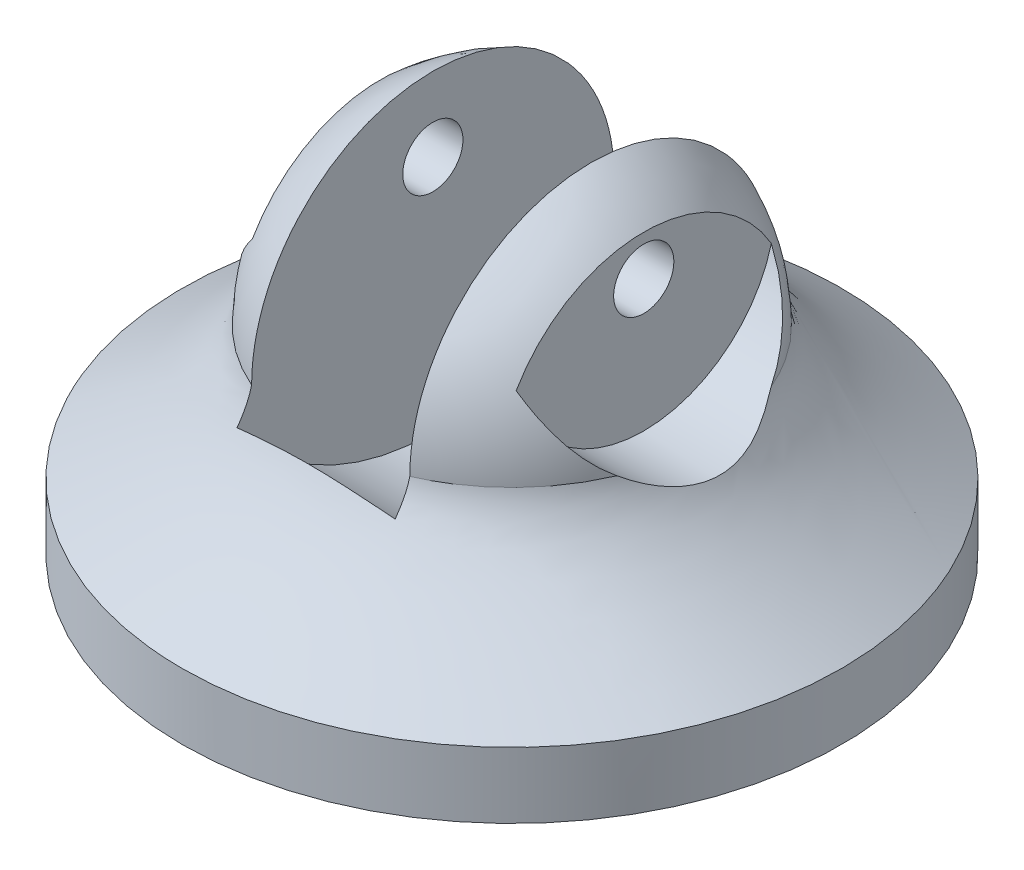
ISO-10303-21;
HEADER;
FILE_DESCRIPTION(('STEP AP214'),'2;1');
FILE_NAME('part.step','',(''),(''),'','','');
FILE_SCHEMA(('AUTOMOTIVE_DESIGN { 1 0 10303 214 1 1 1 1 }'));
ENDSEC;
DATA;
#1=APPLICATION_CONTEXT('core data for automotive mechanical design processes');
#2=APPLICATION_PROTOCOL_DEFINITION('international standard','automotive_design',2000,#1);
#3=PRODUCT_CONTEXT('',#1,'mechanical');
#4=PRODUCT('Part','Part','',(#3));
#5=PRODUCT_RELATED_PRODUCT_CATEGORY('part','',(#4));
#6=PRODUCT_DEFINITION_FORMATION('','',#4);
#7=PRODUCT_DEFINITION_CONTEXT('part definition',#1,'design');
#8=PRODUCT_DEFINITION('design','',#6,#7);
#9=PRODUCT_DEFINITION_SHAPE('','',#8);
#10=(LENGTH_UNIT() NAMED_UNIT(*) SI_UNIT(.MILLI.,.METRE.));
#11=(NAMED_UNIT(*) PLANE_ANGLE_UNIT() SI_UNIT($,.RADIAN.));
#12=(NAMED_UNIT(*) SI_UNIT($,.STERADIAN.) SOLID_ANGLE_UNIT());
#13=UNCERTAINTY_MEASURE_WITH_UNIT(LENGTH_MEASURE(1.E-05),#10,'distance_accuracy_value','');
#14=(GEOMETRIC_REPRESENTATION_CONTEXT(3) GLOBAL_UNCERTAINTY_ASSIGNED_CONTEXT((#13)) GLOBAL_UNIT_ASSIGNED_CONTEXT((#10,
#11,#12)) REPRESENTATION_CONTEXT('',''));
#15=CARTESIAN_POINT('',(0.,0.,0.));
#16=DIRECTION('',(0.,0.,1.));
#17=DIRECTION('',(1.,0.,0.));
#18=AXIS2_PLACEMENT_3D('',#15,#16,#17);
#19=CARTESIAN_POINT('',(0.,6.35,0.));
#20=DIRECTION('',(0.,0.,-1.));
#21=DIRECTION('',(1.,0.,0.));
#22=AXIS2_PLACEMENT_3D('',#19,#20,#21);
#23=SPHERICAL_SURFACE('',#22,9.525);
#24=CARTESIAN_POINT('',(3.03398479089716,6.34999999999998,-9.02887375527008));
#25=CARTESIAN_POINT('',(21.0917323014373,6.34999999999998,-2.96090417347577));
#26=CARTESIAN_POINT('',(15.023762719643,6.34999999999998,15.0968433370644));
#27=CARTESIAN_POINT('',(-3.03398479089716,6.34999999999998,9.02887375527008));
#28=CARTESIAN_POINT('',(-21.0917323014373,6.34999999999998,2.96090417347576));
#29=CARTESIAN_POINT('',(-15.023762719643,6.34999999999998,-15.0968433370644));
#30=CARTESIAN_POINT('',(3.03398479089716,6.34999999999998,-9.02887375527008));
#31=(BOUNDED_CURVE() B_SPLINE_CURVE(3,(#24,#25,#26,#27,#28,#29,#30),.UNSPECIFIED.,.T.,
.F.) B_SPLINE_CURVE_WITH_KNOTS((4,3,4),(0.,0.5,1.),
.UNSPECIFIED.) CURVE() GEOMETRIC_REPRESENTATION_ITEM() RATIONAL_B_SPLINE_CURVE((1.,
0.333333333333333,0.333333333333333,1.,0.333333333333333,0.333333333333333,1.)) REPRESENTATION_ITEM(''));
#32=CARTESIAN_POINT('',(3.81,6.35000000000001,8.72980669889088));
#33=VERTEX_POINT('',#32);
#34=CARTESIAN_POINT('',(8.77072545460181,6.35000000000002,3.71483512420132));
#35=VERTEX_POINT('',#34);
#36=EDGE_CURVE('E123',#33,#35,#31,.F.);
#37=ORIENTED_EDGE('',*,*,#36,.T.);
#38=CARTESIAN_POINT('',(8.77107775589751,6.34939999999999,3.71400318255112));
#39=CARTESIAN_POINT('',(8.7077618303584,6.4572277121186,3.86358955060089));
#40=CARTESIAN_POINT('',(8.64041494247986,6.57076736499505,4.00726830740088));
#41=CARTESIAN_POINT('',(8.4981007902398,6.80757139493222,4.28210049636546));
#42=CARTESIAN_POINT('',(8.42313945804915,6.9308281851716,4.41326352694876));
#43=CARTESIAN_POINT('',(8.2662812289785,7.18498430500689,4.662044324416));
#44=CARTESIAN_POINT('',(8.18441596472406,7.3158480061604,4.77971860394295));
#45=CARTESIAN_POINT('',(8.01381636942561,7.58414079323163,5.00188752946153));
#46=CARTESIAN_POINT('',(7.92508104363113,7.72157082881451,5.10638026105002));
#47=CARTESIAN_POINT('',(7.74135853796951,8.00101028349451,5.3017499536325));
#48=CARTESIAN_POINT('',(7.64639088963747,8.14300474560779,5.39266677814555));
#49=CARTESIAN_POINT('',(7.45024774045632,8.43049050080326,5.56132960000119));
#50=CARTESIAN_POINT('',(7.34907169494656,8.57598210000512,5.63907443951307));
#51=CARTESIAN_POINT('',(7.14081377678903,8.86895571632035,5.78157721160204));
#52=CARTESIAN_POINT('',(7.03373428237884,9.01643691408696,5.84634032589511));
#53=CARTESIAN_POINT('',(6.81385776910183,9.31204339565976,5.9632703278439));
#54=CARTESIAN_POINT('',(6.70106297704109,9.46016840836661,6.01544207640188));
#55=CARTESIAN_POINT('',(6.54680989502385,9.65741768743584,6.07701238976482));
#56=CARTESIAN_POINT('',(6.50781408183392,9.70684723893119,6.09177650982965));
#57=CARTESIAN_POINT('',(6.42924899090146,9.80552650222832,6.11995813711261));
#58=CARTESIAN_POINT('',(6.3896805073571,9.85477636294287,6.13337733655755));
#59=CARTESIAN_POINT('',(6.3498,9.90394805436892,6.14614661286626));
#60=B_SPLINE_CURVE_WITH_KNOTS('',3,(#38,#39,#40,#41,#42,#43,#44,#45,#46,#47,#48,#49,#50,#51,#52,
#53,#54,#55,#56,#57,#58,#59),.UNSPECIFIED.,.F.,.F.,(4,2,2,2,2,2,2,2,2,2,4),(0.,
0.584592865547045,1.16873373651216,1.75033017187832,2.33201097755506,2.91194868247854,
3.49193733809017,4.07169402550626,4.65122653829889,4.84521844810046,5.03896312249994),.UNSPECIFIED.);
#61=CARTESIAN_POINT('',(6.35,9.90370145631068,6.14608257017552));
#62=VERTEX_POINT('',#61);
#63=EDGE_CURVE('E59',#35,#62,#60,.T.);
#64=ORIENTED_EDGE('',*,*,#63,.T.);
#65=CARTESIAN_POINT('',(6.35,6.35,0.));
#66=DIRECTION('',(1.,0.,0.));
#67=DIRECTION('',(0.,0.,-1.));
#68=AXIS2_PLACEMENT_3D('',#65,#66,#67);
#69=CIRCLE('',#68,7.09951582856183);
#70=CARTESIAN_POINT('',(6.35,9.90370145631068,-6.14608257017552));
#71=VERTEX_POINT('',#70);
#72=EDGE_CURVE('E109',#62,#71,#69,.F.);
#73=ORIENTED_EDGE('',*,*,#72,.T.);
#74=CARTESIAN_POINT('',(6.3498,9.90394805436893,-6.14614661286625));
#75=CARTESIAN_POINT('',(6.48636357300462,9.73556501605556,-6.10245568982496));
#76=CARTESIAN_POINT('',(6.6193363820469,9.56618501286046,-6.05104910253582));
#77=CARTESIAN_POINT('',(6.87795059005317,9.22729772607008,-5.93207287729463));
#78=CARTESIAN_POINT('',(7.00358634025462,9.05779044357707,-5.86449098493335));
#79=CARTESIAN_POINT('',(7.24349981308209,8.72585275581335,-5.71478580778331));
#80=CARTESIAN_POINT('',(7.35800566260578,8.56336297582853,-5.63316182919665));
#81=CARTESIAN_POINT('',(7.57943502366461,8.24223730337217,-5.45374089916612));
#82=CARTESIAN_POINT('',(7.68636066319935,8.08360033758357,-5.35594851258883));
#83=CARTESIAN_POINT('',(7.88484959188138,7.78338830895912,-5.15168361655766));
#84=CARTESIAN_POINT('',(7.97696466517509,7.64140752086604,-5.04634443798613));
#85=CARTESIAN_POINT('',(8.15399669257176,7.36415489125095,-4.82173377676767));
#86=CARTESIAN_POINT('',(8.23891476991783,7.22888200419181,-4.70246447514588));
#87=CARTESIAN_POINT('',(8.40349283840552,6.96300026301562,-4.44669321580132));
#88=CARTESIAN_POINT('',(8.48293449353925,6.83263360377504,-4.30979751495974));
#89=CARTESIAN_POINT('',(8.6334349258235,6.58253134114235,-4.02212526652034));
#90=CARTESIAN_POINT('',(8.7044859021484,6.46280565586166,-3.87133603031597));
#91=CARTESIAN_POINT('',(8.77107775589753,6.34939999999999,-3.71400318255114));
#92=B_SPLINE_CURVE_WITH_KNOTS('',3,(#74,#75,#76,#77,#78,#79,#80,#81,#82,#83,#84,#85,#86,#87,#88,
#89,#90,#91),.UNSPECIFIED.,.F.,.F.,(4,2,2,2,2,2,2,2,4),(0.,0.663415411969313,1.32733502720673,
1.97125709126808,2.61499766470317,3.21234915561446,3.80960724487423,4.42385795133514,
5.03867530517755),.UNSPECIFIED.);
#93=CARTESIAN_POINT('',(8.77072545460182,6.34999999999999,-3.71483512420133));
#94=VERTEX_POINT('',#93);
#95=EDGE_CURVE('E115',#71,#94,#92,.T.);
#96=ORIENTED_EDGE('',*,*,#95,.T.);
#97=CARTESIAN_POINT('',(3.03398479089716,6.34999999999998,-9.02887375527008));
#98=CARTESIAN_POINT('',(21.0917323014373,6.34999999999998,-2.96090417347577));
#99=CARTESIAN_POINT('',(15.023762719643,6.34999999999998,15.0968433370644));
#100=CARTESIAN_POINT('',(-3.03398479089716,6.34999999999998,9.02887375527008));
#101=CARTESIAN_POINT('',(-21.0917323014373,6.34999999999998,2.96090417347576));
#102=CARTESIAN_POINT('',(-15.023762719643,6.34999999999998,-15.0968433370644));
#103=CARTESIAN_POINT('',(3.03398479089716,6.34999999999998,-9.02887375527008));
#104=(BOUNDED_CURVE() B_SPLINE_CURVE(3,(#97,#98,#99,#100,#101,#102,#103),.UNSPECIFIED.,.T.,
.F.) B_SPLINE_CURVE_WITH_KNOTS((4,3,4),(0.,0.5,1.),
.UNSPECIFIED.) CURVE() GEOMETRIC_REPRESENTATION_ITEM() RATIONAL_B_SPLINE_CURVE((1.,
0.333333333333333,0.333333333333333,1.,0.333333333333333,0.333333333333333,1.)) REPRESENTATION_ITEM(''));
#105=CARTESIAN_POINT('',(3.81,6.35000000000001,-8.72980669889088));
#106=VERTEX_POINT('',#105);
#107=EDGE_CURVE('E302',#94,#106,#104,.F.);
#108=ORIENTED_EDGE('',*,*,#107,.T.);
#109=CARTESIAN_POINT('',(3.81,6.35,0.));
#110=DIRECTION('',(1.,0.,0.));
#111=DIRECTION('',(0.,1.,0.));
#112=AXIS2_PLACEMENT_3D('',#109,#110,#111);
#113=CIRCLE('',#112,8.72980669889088);
#114=EDGE_CURVE('E246',#33,#106,#113,.F.);
#115=ORIENTED_EDGE('',*,*,#114,.F.);
#116=EDGE_LOOP('',(#37,#64,#73,#96,#108,#115));
#117=FACE_BOUND('',#116,.T.);
#118=ADVANCED_FACE('F36',(#117),#23,.T.);
#119=CARTESIAN_POINT('',(14.4054801292425,0.,-6.67066467797628));
#120=CARTESIAN_POINT('',(3.03398479089713,6.35,-9.02887375527008));
#121=CARTESIAN_POINT('',(1.06415077328991,0.,-35.4816249364612));
#122=CARTESIAN_POINT('',(-15.023762719643,6.35,-15.0968433370643));
#123=CARTESIAN_POINT('',(-27.746809485195,0.,-22.1402955805087));
#124=CARTESIAN_POINT('',(-21.0917323014373,6.35,2.96090417347582));
#125=CARTESIAN_POINT('',(-14.4054801292425,0.,6.67066467797628));
#126=CARTESIAN_POINT('',(-3.03398479089713,6.35,9.02887375527008));
#127=CARTESIAN_POINT('',(-1.06415077328991,0.,35.4816249364612));
#128=CARTESIAN_POINT('',(15.023762719643,6.35,15.0968433370643));
#129=CARTESIAN_POINT('',(27.746809485195,0.,22.1402955805087));
#130=CARTESIAN_POINT('',(21.0917323014373,6.35,-2.96090417347583));
#131=CARTESIAN_POINT('',(14.4054801292425,0.,-6.67066467797628));
#132=CARTESIAN_POINT('',(3.03398479089713,6.35,-9.02887375527008));
#133=(BOUNDED_SURFACE() B_SPLINE_SURFACE(3,1,((#119,#120),(#121,#122),(#123,#124),(#125,#126),
(#127,#128),(#129,#130),(#131,#132)),.UNSPECIFIED.,.T.,.F.,.F.) B_SPLINE_SURFACE_WITH_KNOTS((4,
3,4),(2,2),(0.,0.5,1.),(0.,1.),
.UNSPECIFIED.) GEOMETRIC_REPRESENTATION_ITEM() RATIONAL_B_SPLINE_SURFACE(((1.,1.),
(0.333333333333333,0.333333333333333),(0.333333333333333,0.333333333333333),(1.,1.),
(0.333333333333333,0.333333333333333),(0.333333333333333,0.333333333333333),(1.,1.))) REPRESENTATION_ITEM('') SURFACE());
#134=CARTESIAN_POINT('',(14.4054801292425,0.,-6.67066467797628));
#135=CARTESIAN_POINT('',(1.06415077328991,0.,-35.4816249364612));
#136=CARTESIAN_POINT('',(-27.746809485195,0.,-22.1402955805087));
#137=CARTESIAN_POINT('',(-14.4054801292425,0.,6.67066467797628));
#138=CARTESIAN_POINT('',(-1.06415077328991,0.,35.4816249364612));
#139=CARTESIAN_POINT('',(27.746809485195,0.,22.1402955805087));
#140=CARTESIAN_POINT('',(14.4054801292425,0.,-6.67066467797628));
#141=(BOUNDED_CURVE() B_SPLINE_CURVE(3,(#134,#135,#136,#137,#138,#139,#140),.UNSPECIFIED.,.T.,
.F.) B_SPLINE_CURVE_WITH_KNOTS((4,3,4),(0.,0.5,1.),
.UNSPECIFIED.) CURVE() GEOMETRIC_REPRESENTATION_ITEM() RATIONAL_B_SPLINE_CURVE((1.,
0.333333333333333,0.333333333333333,1.,0.333333333333333,0.333333333333333,1.)) REPRESENTATION_ITEM(''));
#142=CARTESIAN_POINT('',(14.4054801292425,0.,-6.67066467797628));
#143=VERTEX_POINT('',#142);
#144=EDGE_CURVE('E185',#143,#143,#141,.T.);
#145=CARTESIAN_POINT('',(8.77072545460182,6.34999999999999,-3.71483512420133));
#146=CARTESIAN_POINT('',(8.80076764859968,6.31356121721888,-3.66431601436541));
#147=CARTESIAN_POINT('',(8.83098138840419,6.27791423587161,-3.61333375033514));
#148=CARTESIAN_POINT('',(8.89154456139817,6.20816896696116,-3.5103979671432));
#149=CARTESIAN_POINT('',(8.92189399696227,6.17407070661762,-3.45844443093351));
#150=CARTESIAN_POINT('',(9.01310933953646,6.07374473426873,-3.30058417941611));
#151=CARTESIAN_POINT('',(9.07386475474363,6.00981728824407,-3.19313729118857));
#152=CARTESIAN_POINT('',(9.19362601927313,5.88791039293178,-2.97367301853966));
#153=CARTESIAN_POINT('',(9.25262861321847,5.82994157223441,-2.86164794862102));
#154=CARTESIAN_POINT('',(9.3682399381122,5.71930036675687,-2.63108761226698));
#155=CARTESIAN_POINT('',(9.42479445950431,5.6667289048107,-2.51247631777484));
#156=CARTESIAN_POINT('',(9.53286160301886,5.56835426610279,-2.27048636826459));
#157=CARTESIAN_POINT('',(9.58438205635209,5.52254051828281,-2.14711554832554));
#158=CARTESIAN_POINT('',(9.68089741102914,5.43809054558415,-1.89560577098778));
#159=CARTESIAN_POINT('',(9.72589999939539,5.39944585032038,-1.76747265808846));
#160=CARTESIAN_POINT('',(9.80152849856971,5.33527870191703,-1.52698663384593));
#161=CARTESIAN_POINT('',(9.83330199718569,5.30864960737773,-1.41529091653546));
#162=CARTESIAN_POINT('',(9.89030781443506,5.26123856320346,-1.18899783621098));
#163=CARTESIAN_POINT('',(9.9155397845706,5.24045692508484,-1.07440031896134));
#164=CARTESIAN_POINT('',(9.95855785495096,5.20520911198642,-0.843593242036506));
#165=CARTESIAN_POINT('',(9.9763888725556,5.19070481532454,-0.727397964508049));
#166=CARTESIAN_POINT('',(10.0042420740971,5.168111472462,-0.493451884704946));
#167=CARTESIAN_POINT('',(10.0142645980948,5.16002214688832,-0.375701150397772));
#168=CARTESIAN_POINT('',(10.0261877926366,5.15040362989601,-0.138795237604165));
#169=CARTESIAN_POINT('',(10.028038548566,5.14891475498341,-0.0196358735067202));
#170=CARTESIAN_POINT('',(10.0234148958574,5.15264095191123,0.218413475107677));
#171=CARTESIAN_POINT('',(10.0169404941106,5.15785601820251,0.337303459847525));
#172=CARTESIAN_POINT('',(9.9958796366463,5.17488880736616,0.574094583974998));
#173=CARTESIAN_POINT('',(9.98127864835341,5.18671835893592,0.691993566666355));
#174=CARTESIAN_POINT('',(9.94445774146338,5.21674045218687,0.925767255700933));
#175=CARTESIAN_POINT('',(9.92223702019933,5.23493366422363,1.04164174743114));
#176=CARTESIAN_POINT('',(9.86508837387131,5.28213185693655,1.29652709613799));
#177=CARTESIAN_POINT('',(9.82842552015029,5.3126491638125,1.4348696238783));
#178=CARTESIAN_POINT('',(9.74626093613811,5.38205560546786,1.70673972423224));
#179=CARTESIAN_POINT('',(9.70075649711321,5.42094730624699,1.84026580636403));
#180=CARTESIAN_POINT('',(9.60245800113234,5.50656630932754,2.10245821137084));
#181=CARTESIAN_POINT('',(9.54964334222559,5.55331583963805,2.23110944240757));
#182=CARTESIAN_POINT('',(9.43852406813553,5.65404984654304,2.48310055968944));
#183=CARTESIAN_POINT('',(9.38021847002989,5.70803561921808,2.60643948920907));
#184=CARTESIAN_POINT('',(9.27625448159657,5.80721336240989,2.81498336596312));
#185=CARTESIAN_POINT('',(9.23148478047781,5.85078693457693,2.90141277414579));
#186=CARTESIAN_POINT('',(9.14060691407431,5.94150705427889,3.07163719787632));
#187=CARTESIAN_POINT('',(9.09449890651125,5.98865318182846,3.15543252145043));
#188=CARTESIAN_POINT('',(9.00201336725577,6.08609434285163,3.31981719242848));
#189=CARTESIAN_POINT('',(8.95564155938155,6.13635882460036,3.40042790668524));
#190=CARTESIAN_POINT('',(8.86295885082513,6.24047190305977,3.55933319645988));
#191=CARTESIAN_POINT('',(8.81664794869852,6.29432041315145,3.63762782788696));
#192=CARTESIAN_POINT('',(8.77072545460182,6.35,3.7148351242013));
#193=B_SPLINE_CURVE_WITH_KNOTS('',3,(#145,#146,#147,#148,#149,#150,#151,#152,#153,#154,#155,
#156,#157,#158,#159,#160,#161,#162,#163,#164,#165,#166,#167,#168,#169,#170,#171,#172,#173,#174,
#175,#176,#177,#178,#179,#180,#181,#182,#183,#184,#185,#186,#187,#188,#189,#190,#191,#192),
.UNSPECIFIED.,.F.,.F.,(4,2,2,2,2,2,2,2,2,2,2,2,2,2,2,2,2,2,2,2,2,2,2,4),(0.,0.207452369888065,
0.414908384458078,0.831710656885543,1.24924394176135,1.6735358667419,2.09715687019105,
2.5202741236521,2.87737358066797,3.23449205813668,3.58941027318072,3.94431303063129,
4.30138062475556,4.65844792331947,5.0161558177459,5.37390140490198,5.81223664682754,
6.25070639075472,6.69043800932427,7.13024849356052,7.45008431869084,7.7698826024615,
8.08693189656115,8.40397353097609),.UNSPECIFIED.);
#194=EDGE_CURVE('E12',#94,#35,#193,.T.);
#195=CARTESIAN_POINT('',(3.81,2.71799409990451,11.638));
#196=CARTESIAN_POINT('',(3.81,2.79702801736605,11.5413886661668));
#197=CARTESIAN_POINT('',(3.81,2.87678076670024,11.4453579539062));
#198=CARTESIAN_POINT('',(3.81,3.03803014047549,11.2545787420753));
#199=CARTESIAN_POINT('',(3.81,3.11952871212552,11.1598318896986));
#200=CARTESIAN_POINT('',(3.81,3.28442663021219,10.9719292193822));
#201=CARTESIAN_POINT('',(3.81,3.36782679694814,10.8787741195994));
#202=CARTESIAN_POINT('',(3.81,3.53918940317475,10.6917474072272));
#203=CARTESIAN_POINT('',(3.81,3.62721404881744,10.597932650527));
#204=CARTESIAN_POINT('',(3.81,3.80581261426146,10.4128170044704));
#205=CARTESIAN_POINT('',(3.81,3.8963856361763,10.3215152515755));
#206=CARTESIAN_POINT('',(3.81,4.08047944546702,10.1419652790915));
#207=CARTESIAN_POINT('',(3.81,4.17399955809506,10.0537163701099));
#208=CARTESIAN_POINT('',(3.81,4.37140277246995,9.87467748010207));
#209=CARTESIAN_POINT('',(3.81,4.47554443902818,9.78417090754688));
#210=CARTESIAN_POINT('',(3.81,4.68838844124456,9.60869831156386));
#211=CARTESIAN_POINT('',(3.81,4.79708964986726,9.52373093205785));
#212=CARTESIAN_POINT('',(3.81,5.01850941001587,9.36188053302988));
#213=CARTESIAN_POINT('',(3.81,5.13116866178737,9.28491698714057));
#214=CARTESIAN_POINT('',(3.81,5.36224291976867,9.14018464601004));
#215=CARTESIAN_POINT('',(3.81,5.48065363603926,9.07240913635445));
#216=CARTESIAN_POINT('',(3.81,5.66130183766907,8.98055662542585));
#217=CARTESIAN_POINT('',(3.81,5.72121840882676,8.95188911274778));
#218=CARTESIAN_POINT('',(3.81,5.84248600319688,8.89780321014254));
#219=CARTESIAN_POINT('',(3.81,5.90383653783856,8.87238373211775));
#220=CARTESIAN_POINT('',(3.81,6.02854113329434,8.82496381375378));
#221=CARTESIAN_POINT('',(3.81,6.09190890612591,8.80299917291314));
#222=CARTESIAN_POINT('',(3.81,6.21999288405588,8.76319319182993));
#223=CARTESIAN_POINT('',(3.81000000000001,6.28471038936651,8.74535604855844));
#224=CARTESIAN_POINT('',(3.81000000000002,6.35,8.72980669889087));
#225=B_SPLINE_CURVE_WITH_KNOTS('',3,(#195,#196,#197,#198,#199,#200,#201,#202,#203,#204,#205,
#206,#207,#208,#209,#210,#211,#212,#213,#214,#215,#216,#217,#218,#219,#220,#221,#222,#223,#224),
.UNSPECIFIED.,.F.,.F.,(4,2,2,2,2,2,2,2,2,2,2,2,2,2,4),(0.,0.374466092712256,0.749374171938881,
1.1244471567148,1.51034036892907,1.89609927863317,2.28177050001137,2.69554451552373,
3.10921684951924,3.51821317043734,3.92690897587344,4.12609566059477,4.32521544148022,
4.52627905314721,4.72754622300388),.UNSPECIFIED.);
#226=CARTESIAN_POINT('',(3.81,4.92167464178369,9.4326897267666));
#227=VERTEX_POINT('',#226);
#228=EDGE_CURVE('E357',#227,#33,#225,.T.);
#229=CARTESIAN_POINT('',(-3.81,4.92167464178369,9.43268972676661));
#230=CARTESIAN_POINT('',(-3.58588198813242,4.98518203965562,9.47699137558659));
#231=CARTESIAN_POINT('',(-3.36016428028079,5.04558459438199,9.51814905538338));
#232=CARTESIAN_POINT('',(-2.90448357104282,5.15843363094595,9.59370198126023));
#233=CARTESIAN_POINT('',(-2.67450555448382,5.21084119017914,9.6280643713724));
#234=CARTESIAN_POINT('',(-2.21106853390105,5.30537831060969,9.68916173667705));
#235=CARTESIAN_POINT('',(-1.97760531671763,5.34749414473903,9.71588653283396));
#236=CARTESIAN_POINT('',(-1.51629545399603,5.4178260294586,9.76006302658139));
#237=CARTESIAN_POINT('',(-1.2885460565691,5.44648483610801,9.77781185529183));
#238=CARTESIAN_POINT('',(-0.831599399056435,5.49026653467657,9.80478328612688));
#239=CARTESIAN_POINT('',(-0.602405183714587,5.50541190076933,9.81402004549882));
#240=CARTESIAN_POINT('',(-0.143602562022976,5.52115178971261,9.82361787047656));
#241=CARTESIAN_POINT('',(0.0860049551187355,5.52176467315116,9.82399013563903));
#242=CARTESIAN_POINT('',(0.510823168087049,5.50943584359493,9.81647436666875));
#243=CARTESIAN_POINT('',(0.706117706097392,5.49847780631716,9.80979523002099));
#244=CARTESIAN_POINT('',(1.09576303364977,5.46656571894524,9.79020024573817));
#245=CARTESIAN_POINT('',(1.29011266734515,5.44560155842232,9.77727808984394));
#246=CARTESIAN_POINT('',(1.67734970004731,5.39462896465102,9.74552924550175));
#247=CARTESIAN_POINT('',(1.87023509413063,5.36460984681732,9.72669558057448));
#248=CARTESIAN_POINT('',(2.26009526010982,5.29565625397848,9.68286311607711));
#249=CARTESIAN_POINT('',(2.45700475060112,5.25646839588854,9.65768714661641));
#250=CARTESIAN_POINT('',(2.84827963656443,5.17116276392645,9.60199981279279));
#251=CARTESIAN_POINT('',(3.04264777272602,5.12505326529001,9.57149481256869));
#252=CARTESIAN_POINT('',(3.42838431481389,5.02725903641562,9.50563601578243));
#253=CARTESIAN_POINT('',(3.61976104110771,4.97559512402463,9.4703001984415));
#254=CARTESIAN_POINT('',(3.81,4.92167464178369,9.4326897267666));
#255=B_SPLINE_CURVE_WITH_KNOTS('',3,(#229,#230,#231,#232,#233,#234,#235,#236,#237,#238,#239,
#240,#241,#242,#243,#244,#245,#246,#247,#248,#249,#250,#251,#252,#253,#254),.UNSPECIFIED.,.F.,
.F.,(4,2,2,2,2,2,2,2,2,2,2,2,4),(0.,0.711445978469023,1.42625200688389,2.1420063000952,
2.83219436526777,3.52123242903647,4.20939990384061,4.79618067561188,5.38355560406618,
5.97162634720194,6.57841715381781,7.18448819990835,7.78836206156681),.UNSPECIFIED.);
#256=CARTESIAN_POINT('',(-3.81,4.92167464178369,9.43268972676661));
#257=VERTEX_POINT('',#256);
#258=EDGE_CURVE('E237',#257,#227,#255,.T.);
#259=CARTESIAN_POINT('',(-3.81,6.34999999999998,8.72980669889088));
#260=CARTESIAN_POINT('',(-3.81,6.28420111072235,8.74547723892634));
#261=CARTESIAN_POINT('',(-3.81,6.21898339185428,8.76347149016187));
#262=CARTESIAN_POINT('',(-3.81,6.09020916487305,8.80356338587245));
#263=CARTESIAN_POINT('',(-3.81,6.02664551604579,8.8256380224871));
#264=CARTESIAN_POINT('',(-3.81,5.9011125135284,8.87346769355124));
#265=CARTESIAN_POINT('',(-3.81,5.83913955507276,8.89921334059752));
#266=CARTESIAN_POINT('',(-3.81,5.71670910872132,8.95398811076343));
#267=CARTESIAN_POINT('',(-3.81,5.65625080953025,8.98301542811492));
#268=CARTESIAN_POINT('',(-3.81,5.53784558260363,9.04344758871794));
#269=CARTESIAN_POINT('',(-3.81,5.47987336541609,9.07480310764721));
#270=CARTESIAN_POINT('',(-3.81,5.36527612588833,9.14000935559852));
#271=CARTESIAN_POINT('',(-3.80999999999999,5.30865254021259,9.17386260078115));
#272=CARTESIAN_POINT('',(-3.81,5.19671535292564,9.24376138701049));
#273=CARTESIAN_POINT('',(-3.81000000000001,5.14140284510384,9.27980867482119));
#274=CARTESIAN_POINT('',(-3.80999999999999,5.03206366451863,9.35380936670901));
#275=CARTESIAN_POINT('',(-3.80999999999996,4.9780371428243,9.39176299311719));
#276=CARTESIAN_POINT('',(-3.80999999999993,4.82099927442583,9.50578976374638));
#277=CARTESIAN_POINT('',(-3.80999999999998,4.71965989995934,9.5841721498409));
#278=CARTESIAN_POINT('',(-3.81000000000002,4.52101157783015,9.74583823173288));
#279=CARTESIAN_POINT('',(-3.81,4.42370262321173,9.82912191907104));
#280=CARTESIAN_POINT('',(-3.80999999999999,4.23248796815178,9.99967305040121));
#281=CARTESIAN_POINT('',(-3.81,4.13858560169926,10.0869442177373));
#282=CARTESIAN_POINT('',(-3.81,3.95373303443684,10.264716216275));
#283=CARTESIAN_POINT('',(-3.81,3.86278569329493,10.3552200078745));
#284=CARTESIAN_POINT('',(-3.81,3.6802234202192,10.5421903477426));
#285=CARTESIAN_POINT('',(-3.81,3.5887078848277,10.6387536675692));
#286=CARTESIAN_POINT('',(-3.81,3.40821230828287,10.8340740446379));
#287=CARTESIAN_POINT('',(-3.81,3.31923032325245,10.9328293105724));
#288=CARTESIAN_POINT('',(-3.81,3.14362258354527,11.1319778525989));
#289=CARTESIAN_POINT('',(-3.81,3.05699158692797,11.2323665191508));
#290=CARTESIAN_POINT('',(-3.81,2.88597636471996,11.4342923889063));
#291=CARTESIAN_POINT('',(-3.81,2.80158400542451,11.535822697013));
#292=CARTESIAN_POINT('',(-3.81,2.71799409990451,11.638));
#293=B_SPLINE_CURVE_WITH_KNOTS('',3,(#259,#260,#261,#262,#263,#264,#265,#266,#267,#268,#269,
#270,#271,#272,#273,#274,#275,#276,#277,#278,#279,#280,#281,#282,#283,#284,#285,#286,#287,#288,
#289,#290,#291,#292),.UNSPECIFIED.,.F.,.F.,(4,2,2,2,2,2,2,2,2,2,2,2,2,2,2,2,4),(0.,
0.202836100240748,0.404561559939898,0.605780128337344,0.806888508449858,1.0045471545314,
1.20240771069072,1.40042790589926,1.59847124953069,1.98259950563191,2.36672709877461,
2.75122101286179,3.13607655524381,3.53514573021439,3.93389998244548,4.33167660338696,
4.72772302235232),.UNSPECIFIED.);
#294=CARTESIAN_POINT('',(-3.81,6.35,8.72980669889088));
#295=VERTEX_POINT('',#294);
#296=EDGE_CURVE('E349',#295,#257,#293,.T.);
#297=CARTESIAN_POINT('',(0.,6.35,0.));
#298=DIRECTION('',(0.,1.,0.));
#299=DIRECTION('',(0.,0.,1.));
#300=AXIS2_PLACEMENT_3D('',#297,#298,#299);
#301=CIRCLE('',#300,9.525);
#302=CARTESIAN_POINT('',(-8.7707254546018,6.35,3.71483512420135));
#303=VERTEX_POINT('',#302);
#304=EDGE_CURVE('E186',#303,#295,#301,.T.);
#305=CARTESIAN_POINT('',(-8.77072545460181,6.34999999999999,-3.71483512420133));
#306=CARTESIAN_POINT('',(-8.80076764859968,6.31356121721888,-3.66431601436541));
#307=CARTESIAN_POINT('',(-8.83098138840419,6.27791423587161,-3.61333375033514));
#308=CARTESIAN_POINT('',(-8.89154456139817,6.20816896696116,-3.5103979671432));
#309=CARTESIAN_POINT('',(-8.92189399696226,6.17407070661762,-3.45844443093351));
#310=CARTESIAN_POINT('',(-9.01310933953645,6.07374473426873,-3.30058417941611));
#311=CARTESIAN_POINT('',(-9.07386475474363,6.00981728824407,-3.19313729118857));
#312=CARTESIAN_POINT('',(-9.19362601927313,5.88791039293178,-2.97367301853966));
#313=CARTESIAN_POINT('',(-9.25262861321847,5.82994157223441,-2.86164794862102));
#314=CARTESIAN_POINT('',(-9.3682399381122,5.71930036675687,-2.63108761226698));
#315=CARTESIAN_POINT('',(-9.42479445950431,5.66672890481069,-2.51247631777483));
#316=CARTESIAN_POINT('',(-9.53286160301886,5.56835426610279,-2.27048636826458));
#317=CARTESIAN_POINT('',(-9.58438205635209,5.52254051828281,-2.14711554832553));
#318=CARTESIAN_POINT('',(-9.68089741102914,5.43809054558415,-1.89560577098777));
#319=CARTESIAN_POINT('',(-9.72589999939539,5.39944585032037,-1.76747265808846));
#320=CARTESIAN_POINT('',(-9.80152849856971,5.33527870191703,-1.52698663384592));
#321=CARTESIAN_POINT('',(-9.83330199718569,5.30864960737773,-1.41529091653545));
#322=CARTESIAN_POINT('',(-9.89030781443506,5.26123856320346,-1.18899783621097));
#323=CARTESIAN_POINT('',(-9.9155397845706,5.24045692508484,-1.07440031896133));
#324=CARTESIAN_POINT('',(-9.95855785495096,5.20520911198641,-0.843593242036496));
#325=CARTESIAN_POINT('',(-9.9763888725556,5.19070481532454,-0.72739796450804));
#326=CARTESIAN_POINT('',(-10.0042420740971,5.168111472462,-0.493451884704937));
#327=CARTESIAN_POINT('',(-10.0142645980948,5.16002214688832,-0.375701150397762));
#328=CARTESIAN_POINT('',(-10.0261877926366,5.15040362989601,-0.138795237604155));
#329=CARTESIAN_POINT('',(-10.028038548566,5.14891475498341,-0.0196358735067104));
#330=CARTESIAN_POINT('',(-10.0234148958574,5.15264095191123,0.218413475107687));
#331=CARTESIAN_POINT('',(-10.0169404941106,5.15785601820251,0.337303459847536));
#332=CARTESIAN_POINT('',(-9.99587963664631,5.17488880736616,0.574094583975009));
#333=CARTESIAN_POINT('',(-9.98127864835341,5.18671835893592,0.691993566666366));
#334=CARTESIAN_POINT('',(-9.94445774146338,5.21674045218687,0.925767255700945));
#335=CARTESIAN_POINT('',(-9.92223702019933,5.23493366422363,1.04164174743115));
#336=CARTESIAN_POINT('',(-9.86508837387131,5.28213185693655,1.296527096138));
#337=CARTESIAN_POINT('',(-9.82842552015029,5.3126491638125,1.43486962387831));
#338=CARTESIAN_POINT('',(-9.7462609361381,5.38205560546786,1.70673972423225));
#339=CARTESIAN_POINT('',(-9.7007564971132,5.420947306247,1.84026580636405));
#340=CARTESIAN_POINT('',(-9.60245800113233,5.50656630932754,2.10245821137086));
#341=CARTESIAN_POINT('',(-9.54964334222559,5.55331583963806,2.23110944240759));
#342=CARTESIAN_POINT('',(-9.43852406813552,5.65404984654305,2.48310055968946));
#343=CARTESIAN_POINT('',(-9.38021847002988,5.70803561921809,2.6064394892091));
#344=CARTESIAN_POINT('',(-9.27625448159656,5.8072133624099,2.81498336596315));
#345=CARTESIAN_POINT('',(-9.2314847804778,5.85078693457695,2.90141277414582));
#346=CARTESIAN_POINT('',(-9.1406069140743,5.94150705427891,3.07163719787635));
#347=CARTESIAN_POINT('',(-9.09449890651124,5.98865318182847,3.15543252145046));
#348=CARTESIAN_POINT('',(-9.00201336725576,6.08609434285165,3.31981719242851));
#349=CARTESIAN_POINT('',(-8.95564155938153,6.13635882460038,3.40042790668527));
#350=CARTESIAN_POINT('',(-8.86295885082511,6.24047190305979,3.55933319645991));
#351=CARTESIAN_POINT('',(-8.81664794869851,6.29432041315147,3.637627827887));
#352=CARTESIAN_POINT('',(-8.7707254546018,6.35,3.71483512420135));
#353=B_SPLINE_CURVE_WITH_KNOTS('',3,(#305,#306,#307,#308,#309,#310,#311,#312,#313,#314,#315,
#316,#317,#318,#319,#320,#321,#322,#323,#324,#325,#326,#327,#328,#329,#330,#331,#332,#333,#334,
#335,#336,#337,#338,#339,#340,#341,#342,#343,#344,#345,#346,#347,#348,#349,#350,#351,#352),
.UNSPECIFIED.,.F.,.F.,(4,2,2,2,2,2,2,2,2,2,2,2,2,2,2,2,2,2,2,2,2,2,2,4),(0.,0.207452369888066,
0.414908384458079,0.831710656885546,1.24924394176135,1.67353586674191,2.09715687019106,
2.52027412365212,2.87737358066798,3.23449205813669,3.58941027318073,3.9443130306313,
4.30138062475558,4.65844792331948,5.01615581774591,5.373901404902,5.81223664682756,
6.25070639075475,6.69043800932429,7.13024849356056,7.45008431869088,7.76988260246154,
8.08693189656119,8.40397353097613),.UNSPECIFIED.);
#354=CARTESIAN_POINT('',(-8.7707254546018,6.35,-3.71483512420134));
#355=VERTEX_POINT('',#354);
#356=EDGE_CURVE('E330',#355,#303,#353,.T.);
#357=CARTESIAN_POINT('',(-3.80999999999999,6.35,-8.72980669889088));
#358=VERTEX_POINT('',#357);
#359=EDGE_CURVE('E181',#358,#355,#301,.T.);
#360=CARTESIAN_POINT('',(-3.81,2.71799409990451,-11.638));
#361=CARTESIAN_POINT('',(-3.81,2.79702801736605,-11.5413886661668));
#362=CARTESIAN_POINT('',(-3.81,2.87678076670024,-11.4453579539062));
#363=CARTESIAN_POINT('',(-3.81,3.03803014047549,-11.2545787420753));
#364=CARTESIAN_POINT('',(-3.81,3.11952871212552,-11.1598318896986));
#365=CARTESIAN_POINT('',(-3.81,3.28442663021219,-10.9719292193822));
#366=CARTESIAN_POINT('',(-3.81,3.36782679694814,-10.8787741195994));
#367=CARTESIAN_POINT('',(-3.81,3.53918940317475,-10.6917474072272));
#368=CARTESIAN_POINT('',(-3.81,3.62721404881743,-10.597932650527));
#369=CARTESIAN_POINT('',(-3.81,3.80581261426146,-10.4128170044704));
#370=CARTESIAN_POINT('',(-3.81,3.8963856361763,-10.3215152515755));
#371=CARTESIAN_POINT('',(-3.81,4.08047944546702,-10.1419652790915));
#372=CARTESIAN_POINT('',(-3.81,4.17399955809507,-10.0537163701099));
#373=CARTESIAN_POINT('',(-3.81,4.37140277246995,-9.87467748010207));
#374=CARTESIAN_POINT('',(-3.81,4.47554443902818,-9.78417090754688));
#375=CARTESIAN_POINT('',(-3.81,4.68838844124456,-9.60869831156386));
#376=CARTESIAN_POINT('',(-3.81,4.79708964986726,-9.52373093205785));
#377=CARTESIAN_POINT('',(-3.81,5.01850941001588,-9.36188053302988));
#378=CARTESIAN_POINT('',(-3.81,5.13116866178737,-9.28491698714056));
#379=CARTESIAN_POINT('',(-3.81,5.36224291976868,-9.14018464601003));
#380=CARTESIAN_POINT('',(-3.81,5.48065363603927,-9.07240913635445));
#381=CARTESIAN_POINT('',(-3.81,5.66130183766908,-8.98055662542585));
#382=CARTESIAN_POINT('',(-3.81,5.72121840882677,-8.95188911274778));
#383=CARTESIAN_POINT('',(-3.81,5.84248600319689,-8.89780321014254));
#384=CARTESIAN_POINT('',(-3.81,5.90383653783856,-8.87238373211775));
#385=CARTESIAN_POINT('',(-3.81,6.02854113329435,-8.82496381375378));
#386=CARTESIAN_POINT('',(-3.81,6.09190890612591,-8.80299917291314));
#387=CARTESIAN_POINT('',(-3.81,6.21999288405588,-8.76319319182994));
#388=CARTESIAN_POINT('',(-3.81000000000001,6.28471038936651,-8.74535604855845));
#389=CARTESIAN_POINT('',(-3.81000000000002,6.35,-8.72980669889087));
#390=B_SPLINE_CURVE_WITH_KNOTS('',3,(#360,#361,#362,#363,#364,#365,#366,#367,#368,#369,#370,
#371,#372,#373,#374,#375,#376,#377,#378,#379,#380,#381,#382,#383,#384,#385,#386,#387,#388,#389),
.UNSPECIFIED.,.F.,.F.,(4,2,2,2,2,2,2,2,2,2,2,2,2,2,4),(0.,0.374466092712255,0.749374171938881,
1.1244471567148,1.51034036892907,1.89609927863317,2.28177050001137,2.69554451552373,
3.10921684951925,3.51821317043735,3.92690897587345,4.12609566059478,4.32521544148023,
4.52627905314721,4.72754622300388),.UNSPECIFIED.);
#391=CARTESIAN_POINT('',(-3.81,4.92167464178372,-9.43268972676663));
#392=VERTEX_POINT('',#391);
#393=EDGE_CURVE('E347',#392,#358,#390,.T.);
#394=CARTESIAN_POINT('',(3.81,4.92167464178369,-9.4326897267666));
#395=CARTESIAN_POINT('',(3.58588198813242,4.98518203965562,-9.47699137558659));
#396=CARTESIAN_POINT('',(3.36016428028079,5.04558459438199,-9.51814905538337));
#397=CARTESIAN_POINT('',(2.90448357104282,5.15843363094595,-9.59370198126023));
#398=CARTESIAN_POINT('',(2.67450555448382,5.21084119017915,-9.6280643713724));
#399=CARTESIAN_POINT('',(2.21106853390105,5.30537831060969,-9.68916173667705));
#400=CARTESIAN_POINT('',(1.97760531671763,5.34749414473903,-9.71588653283396));
#401=CARTESIAN_POINT('',(1.51629545399603,5.4178260294586,-9.76006302658139));
#402=CARTESIAN_POINT('',(1.2885460565691,5.44648483610801,-9.77781185529183));
#403=CARTESIAN_POINT('',(0.831599399056438,5.49026653467658,-9.80478328612688));
#404=CARTESIAN_POINT('',(0.60240518371459,5.50541190076933,-9.81402004549882));
#405=CARTESIAN_POINT('',(0.143602562022979,5.52115178971262,-9.82361787047656));
#406=CARTESIAN_POINT('',(-0.0860049551187321,5.52176467315116,-9.82399013563903));
#407=CARTESIAN_POINT('',(-0.510823168087046,5.50943584359493,-9.81647436666875));
#408=CARTESIAN_POINT('',(-0.706117706097389,5.49847780631717,-9.809795230021));
#409=CARTESIAN_POINT('',(-1.09576303364977,5.46656571894524,-9.79020024573817));
#410=CARTESIAN_POINT('',(-1.29011266734515,5.44560155842232,-9.77727808984394));
#411=CARTESIAN_POINT('',(-1.67734970004731,5.39462896465102,-9.74552924550175));
#412=CARTESIAN_POINT('',(-1.87023509413063,5.36460984681733,-9.72669558057448));
#413=CARTESIAN_POINT('',(-2.26009526010982,5.29565625397849,-9.68286311607712));
#414=CARTESIAN_POINT('',(-2.45700475060112,5.25646839588854,-9.65768714661641));
#415=CARTESIAN_POINT('',(-2.84827963656443,5.17116276392645,-9.60199981279278));
#416=CARTESIAN_POINT('',(-3.04264777272601,5.12505326529001,-9.57149481256869));
#417=CARTESIAN_POINT('',(-3.42838431481389,5.02725903641562,-9.50563601578244));
#418=CARTESIAN_POINT('',(-3.6197610411077,4.97559512402464,-9.47030019844151));
#419=CARTESIAN_POINT('',(-3.81,4.92167464178369,-9.4326897267666));
#420=B_SPLINE_CURVE_WITH_KNOTS('',3,(#394,#395,#396,#397,#398,#399,#400,#401,#402,#403,#404,
#405,#406,#407,#408,#409,#410,#411,#412,#413,#414,#415,#416,#417,#418,#419),.UNSPECIFIED.,.F.,
.F.,(4,2,2,2,2,2,2,2,2,2,2,2,4),(0.,0.711445978469023,1.42625200688389,2.1420063000952,
2.83219436526777,3.52123242903647,4.20939990384061,4.79618067561188,5.38355560406618,
5.97162634720194,6.57841715381781,7.18448819990835,7.78836206156681),.UNSPECIFIED.);
#421=CARTESIAN_POINT('',(3.81,4.92167464178369,-9.4326897267666));
#422=VERTEX_POINT('',#421);
#423=EDGE_CURVE('E239',#422,#392,#420,.T.);
#424=CARTESIAN_POINT('',(3.81,6.34999999999998,-8.72980669889088));
#425=CARTESIAN_POINT('',(3.81,6.28420111072235,-8.74547723892634));
#426=CARTESIAN_POINT('',(3.81,6.21898339185428,-8.76347149016187));
#427=CARTESIAN_POINT('',(3.81,6.09020916487305,-8.80356338587246));
#428=CARTESIAN_POINT('',(3.81,6.02664551604579,-8.8256380224871));
#429=CARTESIAN_POINT('',(3.81,5.9011125135284,-8.87346769355124));
#430=CARTESIAN_POINT('',(3.81,5.83913955507276,-8.89921334059752));
#431=CARTESIAN_POINT('',(3.81,5.71670910872132,-8.95398811076343));
#432=CARTESIAN_POINT('',(3.81,5.65625080953025,-8.98301542811492));
#433=CARTESIAN_POINT('',(3.81,5.53784558260363,-9.04344758871794));
#434=CARTESIAN_POINT('',(3.81,5.47987336541609,-9.07480310764721));
#435=CARTESIAN_POINT('',(3.81,5.36527612588832,-9.14000935559852));
#436=CARTESIAN_POINT('',(3.81,5.30865254021259,-9.17386260078115));
#437=CARTESIAN_POINT('',(3.81,5.19671535292564,-9.24376138701049));
#438=CARTESIAN_POINT('',(3.81000000000001,5.14140284510384,-9.27980867482119));
#439=CARTESIAN_POINT('',(3.80999999999999,5.03206366451863,-9.35380936670901));
#440=CARTESIAN_POINT('',(3.80999999999996,4.9780371428243,-9.39176299311719));
#441=CARTESIAN_POINT('',(3.80999999999993,4.82099927442583,-9.50578976374638));
#442=CARTESIAN_POINT('',(3.80999999999998,4.71965989995934,-9.5841721498409));
#443=CARTESIAN_POINT('',(3.81000000000002,4.52101157783015,-9.74583823173288));
#444=CARTESIAN_POINT('',(3.81000000000001,4.42370262321173,-9.82912191907104));
#445=CARTESIAN_POINT('',(3.80999999999999,4.23248796815179,-9.99967305040121));
#446=CARTESIAN_POINT('',(3.81,4.13858560169926,-10.0869442177373));
#447=CARTESIAN_POINT('',(3.81,3.95373303443684,-10.264716216275));
#448=CARTESIAN_POINT('',(3.81,3.86278569329492,-10.3552200078745));
#449=CARTESIAN_POINT('',(3.81,3.68022342021919,-10.5421903477426));
#450=CARTESIAN_POINT('',(3.81,3.5887078848277,-10.6387536675692));
#451=CARTESIAN_POINT('',(3.81,3.40821230828287,-10.8340740446379));
#452=CARTESIAN_POINT('',(3.81,3.31923032325245,-10.9328293105724));
#453=CARTESIAN_POINT('',(3.81,3.14362258354527,-11.1319778525989));
#454=CARTESIAN_POINT('',(3.81,3.05699158692797,-11.2323665191508));
#455=CARTESIAN_POINT('',(3.81,2.88597636471996,-11.4342923889063));
#456=CARTESIAN_POINT('',(3.81,2.80158400542451,-11.535822697013));
#457=CARTESIAN_POINT('',(3.81,2.71799409990451,-11.638));
#458=B_SPLINE_CURVE_WITH_KNOTS('',3,(#424,#425,#426,#427,#428,#429,#430,#431,#432,#433,#434,
#435,#436,#437,#438,#439,#440,#441,#442,#443,#444,#445,#446,#447,#448,#449,#450,#451,#452,#453,
#454,#455,#456,#457),.UNSPECIFIED.,.F.,.F.,(4,2,2,2,2,2,2,2,2,2,2,2,2,2,2,2,4),(0.,
0.202836100240748,0.404561559939898,0.605780128337345,0.806888508449858,1.00454715453141,
1.20240771069072,1.40042790589926,1.59847124953069,1.98259950563191,2.36672709877461,
2.75122101286179,3.13607655524381,3.53514573021439,3.93389998244547,4.33167660338696,
4.72772302235232),.UNSPECIFIED.);
#459=EDGE_CURVE('E290',#106,#422,#458,.T.);
#460=ORIENTED_EDGE('',*,*,#144,.T.);
#461=EDGE_LOOP('',(#460));
#462=FACE_BOUND('',#461,.T.);
#463=ORIENTED_EDGE('',*,*,#107,.F.);
#464=ORIENTED_EDGE('',*,*,#194,.T.);
#465=ORIENTED_EDGE('',*,*,#36,.F.);
#466=ORIENTED_EDGE('',*,*,#228,.F.);
#467=ORIENTED_EDGE('',*,*,#258,.F.);
#468=ORIENTED_EDGE('',*,*,#296,.F.);
#469=ORIENTED_EDGE('',*,*,#304,.F.);
#470=ORIENTED_EDGE('',*,*,#356,.F.);
#471=ORIENTED_EDGE('',*,*,#359,.F.);
#472=ORIENTED_EDGE('',*,*,#393,.F.);
#473=ORIENTED_EDGE('',*,*,#423,.F.);
#474=ORIENTED_EDGE('',*,*,#459,.F.);
#475=EDGE_LOOP('',(#463,#464,#465,#466,#467,#468,#469,#470,#471,#472,#473,#474));
#476=FACE_BOUND('',#475,.T.);
#477=ADVANCED_FACE('F260',(#462,#476),#133,.T.);
#478=CARTESIAN_POINT('',(-17.7408924682306,11.5,0.));
#479=DIRECTION('',(1.,0.,0.));
#480=DIRECTION('',(0.,0.,-1.));
#481=AXIS2_PLACEMENT_3D('',#478,#479,#480);
#482=CYLINDRICAL_SURFACE('',#481,1.45);
#483=CARTESIAN_POINT('',(3.81,11.5,0.));
#484=DIRECTION('',(1.,0.,0.));
#485=DIRECTION('',(0.,1.,0.));
#486=AXIS2_PLACEMENT_3D('',#483,#484,#485);
#487=CIRCLE('',#486,1.45);
#488=CARTESIAN_POINT('',(3.81,12.95,0.));
#489=VERTEX_POINT('',#488);
#490=EDGE_CURVE('E334',#489,#489,#487,.T.);
#491=ORIENTED_EDGE('',*,*,#490,.F.);
#492=EDGE_LOOP('',(#491));
#493=FACE_BOUND('',#492,.T.);
#494=CARTESIAN_POINT('',(6.35,11.5,0.));
#495=DIRECTION('',(1.,0.,0.));
#496=DIRECTION('',(0.,0.,-1.));
#497=AXIS2_PLACEMENT_3D('',#494,#495,#496);
#498=CIRCLE('',#497,1.45);
#499=CARTESIAN_POINT('',(6.35,11.5,-1.45));
#500=VERTEX_POINT('',#499);
#501=EDGE_CURVE('E116',#500,#500,#498,.F.);
#502=ORIENTED_EDGE('',*,*,#501,.F.);
#503=EDGE_LOOP('',(#502));
#504=FACE_BOUND('',#503,.T.);
#505=ADVANCED_FACE('F161',(#493,#504),#482,.F.);
#506=CARTESIAN_POINT('',(0.,-3.175,0.));
#507=DIRECTION('',(0.,1.,0.));
#508=DIRECTION('',(0.,0.,1.));
#509=AXIS2_PLACEMENT_3D('',#506,#507,#508);
#510=CYLINDRICAL_SURFACE('',#509,15.875);
#511=CARTESIAN_POINT('',(0.,-3.175,0.));
#512=DIRECTION('',(0.,1.,0.));
#513=DIRECTION('',(0.,0.,1.));
#514=AXIS2_PLACEMENT_3D('',#511,#512,#513);
#515=CIRCLE('',#514,15.875);
#516=CARTESIAN_POINT('',(0.,-3.175,15.875));
#517=VERTEX_POINT('',#516);
#518=EDGE_CURVE('E194',#517,#517,#515,.T.);
#519=ORIENTED_EDGE('',*,*,#518,.T.);
#520=EDGE_LOOP('',(#519));
#521=FACE_BOUND('',#520,.T.);
#522=ORIENTED_EDGE('',*,*,#144,.F.);
#523=EDGE_LOOP('',(#522));
#524=FACE_BOUND('',#523,.T.);
#525=ADVANCED_FACE('F38',(#521,#524),#510,.T.);
#526=CARTESIAN_POINT('',(0.,-3.175,0.));
#527=DIRECTION('',(0.,1.,0.));
#528=DIRECTION('',(0.,0.,1.));
#529=AXIS2_PLACEMENT_3D('',#526,#527,#528);
#530=PLANE('',#529);
#531=ORIENTED_EDGE('',*,*,#518,.F.);
#532=EDGE_LOOP('',(#531));
#533=FACE_BOUND('',#532,.T.);
#534=ADVANCED_FACE('F315',(#533),#530,.F.);
#535=CARTESIAN_POINT('',(-8.77107775589751,6.34939999999999,3.71400318255113));
#536=CARTESIAN_POINT('',(-8.7077618303584,6.4572277121186,3.86358955060089));
#537=CARTESIAN_POINT('',(-8.64041494247986,6.57076736499506,4.00726830740088));
#538=CARTESIAN_POINT('',(-8.49810079023979,6.80757139493223,4.28210049636546));
#539=CARTESIAN_POINT('',(-8.42313945804914,6.93082818517161,4.41326352694876));
#540=CARTESIAN_POINT('',(-8.2662812289785,7.18498430500689,4.662044324416));
#541=CARTESIAN_POINT('',(-8.18441596472406,7.3158480061604,4.77971860394296));
#542=CARTESIAN_POINT('',(-8.0138163694256,7.58414079323164,5.00188752946153));
#543=CARTESIAN_POINT('',(-7.92508104363112,7.72157082881451,5.10638026105002));
#544=CARTESIAN_POINT('',(-7.7413585379695,8.00101028349451,5.3017499536325));
#545=CARTESIAN_POINT('',(-7.64639088963747,8.14300474560779,5.39266677814556));
#546=CARTESIAN_POINT('',(-7.45024774045632,8.43049050080327,5.56132960000119));
#547=CARTESIAN_POINT('',(-7.34907169494656,8.57598210000512,5.63907443951307));
#548=CARTESIAN_POINT('',(-7.14081377678903,8.86895571632036,5.78157721160204));
#549=CARTESIAN_POINT('',(-7.03373428237884,9.01643691408696,5.84634032589512));
#550=CARTESIAN_POINT('',(-6.81385776910182,9.31204339565976,5.96327032784391));
#551=CARTESIAN_POINT('',(-6.70106297704108,9.46016840836661,6.01544207640188));
#552=CARTESIAN_POINT('',(-6.54680989502384,9.65741768743585,6.07701238976482));
#553=CARTESIAN_POINT('',(-6.50781408183391,9.70684723893119,6.09177650982965));
#554=CARTESIAN_POINT('',(-6.42924899090146,9.80552650222832,6.11995813711261));
#555=CARTESIAN_POINT('',(-6.3896805073571,9.85477636294287,6.13337733655755));
#556=CARTESIAN_POINT('',(-6.34979999999999,9.90394805436892,6.14614661286626));
#557=B_SPLINE_CURVE_WITH_KNOTS('',3,(#535,#536,#537,#538,#539,#540,#541,#542,#543,#544,#545,
#546,#547,#548,#549,#550,#551,#552,#553,#554,#555,#556),.UNSPECIFIED.,.F.,.F.,(4,2,2,2,2,2,2,2,
2,2,4),(0.,0.584592865547047,1.16873373651216,1.75033017187832,2.33201097755506,
2.91194868247854,3.49193733809018,4.07169402550626,4.65122653829889,4.84521844810046,
5.03896312249993),.UNSPECIFIED.);
#558=CARTESIAN_POINT('',(-6.35,9.90370145631068,6.14608257017552));
#559=VERTEX_POINT('',#558);
#560=EDGE_CURVE('E52',#303,#559,#557,.T.);
#561=ORIENTED_EDGE('',*,*,#560,.F.);
#562=ORIENTED_EDGE('',*,*,#304,.T.);
#563=CARTESIAN_POINT('',(-3.81,6.35,0.));
#564=DIRECTION('',(-1.,0.,0.));
#565=DIRECTION('',(0.,-1.,0.));
#566=AXIS2_PLACEMENT_3D('',#563,#564,#565);
#567=CIRCLE('',#566,8.72980669889088);
#568=EDGE_CURVE('E198',#358,#295,#567,.F.);
#569=ORIENTED_EDGE('',*,*,#568,.F.);
#570=ORIENTED_EDGE('',*,*,#359,.T.);
#571=CARTESIAN_POINT('',(-6.3498,9.90394805436893,-6.14614661286625));
#572=CARTESIAN_POINT('',(-6.48636357300463,9.73556501605556,-6.10245568982496));
#573=CARTESIAN_POINT('',(-6.6193363820469,9.56618501286046,-6.05104910253582));
#574=CARTESIAN_POINT('',(-6.87795059005317,9.22729772607008,-5.93207287729463));
#575=CARTESIAN_POINT('',(-7.00358634025462,9.05779044357707,-5.86449098493335));
#576=CARTESIAN_POINT('',(-7.2434998130821,8.72585275581335,-5.71478580778331));
#577=CARTESIAN_POINT('',(-7.35800566260579,8.56336297582853,-5.63316182919665));
#578=CARTESIAN_POINT('',(-7.57943502366461,8.24223730337217,-5.45374089916612));
#579=CARTESIAN_POINT('',(-7.68636066319935,8.08360033758357,-5.35594851258883));
#580=CARTESIAN_POINT('',(-7.88484959188138,7.78338830895912,-5.15168361655766));
#581=CARTESIAN_POINT('',(-7.97696466517509,7.64140752086604,-5.04634443798613));
#582=CARTESIAN_POINT('',(-8.15399669257176,7.36415489125095,-4.82173377676767));
#583=CARTESIAN_POINT('',(-8.23891476991783,7.22888200419181,-4.70246447514588));
#584=CARTESIAN_POINT('',(-8.40349283840552,6.96300026301562,-4.44669321580132));
#585=CARTESIAN_POINT('',(-8.48293449353925,6.83263360377504,-4.30979751495974));
#586=CARTESIAN_POINT('',(-8.6334349258235,6.58253134114236,-4.02212526652034));
#587=CARTESIAN_POINT('',(-8.7044859021484,6.46280565586166,-3.87133603031597));
#588=CARTESIAN_POINT('',(-8.77107775589753,6.34939999999999,-3.71400318255114));
#589=B_SPLINE_CURVE_WITH_KNOTS('',3,(#571,#572,#573,#574,#575,#576,#577,#578,#579,#580,#581,
#582,#583,#584,#585,#586,#587,#588),.UNSPECIFIED.,.F.,.F.,(4,2,2,2,2,2,2,2,4),(0.,
0.663415411969313,1.32733502720673,1.97125709126808,2.61499766470317,3.21234915561446,
3.80960724487423,4.42385795133514,5.03867530517754),.UNSPECIFIED.);
#590=CARTESIAN_POINT('',(-6.35,9.90370145631068,-6.14608257017552));
#591=VERTEX_POINT('',#590);
#592=EDGE_CURVE('E236',#591,#355,#589,.T.);
#593=ORIENTED_EDGE('',*,*,#592,.F.);
#594=CARTESIAN_POINT('',(-6.35,6.35,0.));
#595=DIRECTION('',(1.,0.,0.));
#596=DIRECTION('',(0.,0.,-1.));
#597=AXIS2_PLACEMENT_3D('',#594,#595,#596);
#598=CIRCLE('',#597,7.09951582856183);
#599=EDGE_CURVE('E329',#559,#591,#598,.F.);
#600=ORIENTED_EDGE('',*,*,#599,.F.);
#601=EDGE_LOOP('',(#561,#562,#569,#570,#593,#600));
#602=FACE_BOUND('',#601,.T.);
#603=ADVANCED_FACE('F143',(#602),#23,.T.);
#604=CARTESIAN_POINT('',(3.81,11.5,0.));
#605=DIRECTION('',(1.,0.,0.));
#606=DIRECTION('',(0.,1.,0.));
#607=AXIS2_PLACEMENT_3D('',#604,#605,#606);
#608=PLANE('',#607);
#609=ORIENTED_EDGE('',*,*,#490,.T.);
#610=EDGE_LOOP('',(#609));
#611=FACE_BOUND('',#610,.T.);
#612=ORIENTED_EDGE('',*,*,#459,.T.);
#613=CARTESIAN_POINT('',(3.81,11.5,0.));
#614=DIRECTION('',(-1.,0.,0.));
#615=DIRECTION('',(0.,-1.,0.));
#616=AXIS2_PLACEMENT_3D('',#613,#614,#615);
#617=CIRCLE('',#616,11.5);
#618=EDGE_CURVE('E345',#422,#227,#617,.T.);
#619=ORIENTED_EDGE('',*,*,#618,.T.);
#620=ORIENTED_EDGE('',*,*,#228,.T.);
#621=ORIENTED_EDGE('',*,*,#114,.T.);
#622=EDGE_LOOP('',(#612,#619,#620,#621));
#623=FACE_BOUND('',#622,.T.);
#624=ADVANCED_FACE('F268',(#611,#623),#608,.F.);
#625=CARTESIAN_POINT('',(-3.81,11.5,0.));
#626=DIRECTION('',(-1.,0.,0.));
#627=DIRECTION('',(0.,-1.,0.));
#628=AXIS2_PLACEMENT_3D('',#625,#626,#627);
#629=CYLINDRICAL_SURFACE('',#628,11.5);
#630=ORIENTED_EDGE('',*,*,#618,.F.);
#631=ORIENTED_EDGE('',*,*,#423,.T.);
#632=CARTESIAN_POINT('',(-3.81,11.5,0.));
#633=DIRECTION('',(-1.,0.,0.));
#634=DIRECTION('',(0.,-1.,0.));
#635=AXIS2_PLACEMENT_3D('',#632,#633,#634);
#636=CIRCLE('',#635,11.5);
#637=EDGE_CURVE('E343',#392,#257,#636,.T.);
#638=ORIENTED_EDGE('',*,*,#637,.T.);
#639=ORIENTED_EDGE('',*,*,#258,.T.);
#640=EDGE_LOOP('',(#630,#631,#638,#639));
#641=FACE_BOUND('',#640,.T.);
#642=ADVANCED_FACE('F264',(#641),#629,.F.);
#643=CARTESIAN_POINT('',(-3.81,0.,0.));
#644=DIRECTION('',(-1.,0.,0.));
#645=DIRECTION('',(0.,-1.,0.));
#646=AXIS2_PLACEMENT_3D('',#643,#644,#645);
#647=PLANE('',#646);
#648=CARTESIAN_POINT('',(-3.81,11.5,0.));
#649=DIRECTION('',(-1.,0.,0.));
#650=DIRECTION('',(0.,-1.,0.));
#651=AXIS2_PLACEMENT_3D('',#648,#649,#650);
#652=CIRCLE('',#651,1.45);
#653=CARTESIAN_POINT('',(-3.81,10.05,0.));
#654=VERTEX_POINT('',#653);
#655=EDGE_CURVE('E259',#654,#654,#652,.T.);
#656=ORIENTED_EDGE('',*,*,#655,.T.);
#657=EDGE_LOOP('',(#656));
#658=FACE_BOUND('',#657,.T.);
#659=ORIENTED_EDGE('',*,*,#296,.T.);
#660=ORIENTED_EDGE('',*,*,#637,.F.);
#661=ORIENTED_EDGE('',*,*,#393,.T.);
#662=ORIENTED_EDGE('',*,*,#568,.T.);
#663=EDGE_LOOP('',(#659,#660,#661,#662));
#664=FACE_BOUND('',#663,.T.);
#665=ADVANCED_FACE('F267',(#658,#664),#647,.F.);
#666=CARTESIAN_POINT('',(-6.35,11.5,0.));
#667=DIRECTION('',(1.,0.,0.));
#668=DIRECTION('',(0.,0.,-1.));
#669=AXIS2_PLACEMENT_3D('',#666,#667,#668);
#670=CIRCLE('',#669,1.45);
#671=CARTESIAN_POINT('',(-6.35,11.5,-1.45));
#672=VERTEX_POINT('',#671);
#673=EDGE_CURVE('E126',#672,#672,#670,.F.);
#674=ORIENTED_EDGE('',*,*,#673,.T.);
#675=EDGE_LOOP('',(#674));
#676=FACE_BOUND('',#675,.T.);
#677=ORIENTED_EDGE('',*,*,#655,.F.);
#678=EDGE_LOOP('',(#677));
#679=FACE_BOUND('',#678,.T.);
#680=ADVANCED_FACE('F156',(#676,#679),#482,.F.);
#681=CARTESIAN_POINT('',(-6.35,11.5,0.));
#682=DIRECTION('',(1.,0.,0.));
#683=DIRECTION('',(0.,0.,-1.));
#684=AXIS2_PLACEMENT_3D('',#681,#682,#683);
#685=PLANE('',#684);
#686=ORIENTED_EDGE('',*,*,#599,.T.);
#687=CARTESIAN_POINT('',(-6.35,11.5,0.));
#688=DIRECTION('',(1.,0.,0.));
#689=DIRECTION('',(0.,0.,-1.));
#690=AXIS2_PLACEMENT_3D('',#687,#688,#689);
#691=CIRCLE('',#690,6.35);
#692=EDGE_CURVE('E65',#559,#591,#691,.T.);
#693=ORIENTED_EDGE('',*,*,#692,.F.);
#694=EDGE_LOOP('',(#686,#693));
#695=FACE_BOUND('',#694,.T.);
#696=ORIENTED_EDGE('',*,*,#673,.F.);
#697=EDGE_LOOP('',(#696));
#698=FACE_BOUND('',#697,.T.);
#699=ADVANCED_FACE('F150',(#695,#698),#685,.F.);
#700=CARTESIAN_POINT('',(-17.7408924682306,11.5,0.));
#701=DIRECTION('',(1.,0.,0.));
#702=DIRECTION('',(0.,0.,-1.));
#703=AXIS2_PLACEMENT_3D('',#700,#701,#702);
#704=CYLINDRICAL_SURFACE('',#703,6.35);
#705=ORIENTED_EDGE('',*,*,#560,.T.);
#706=ORIENTED_EDGE('',*,*,#692,.T.);
#707=ORIENTED_EDGE('',*,*,#592,.T.);
#708=ORIENTED_EDGE('',*,*,#356,.T.);
#709=EDGE_LOOP('',(#705,#706,#707,#708));
#710=FACE_BOUND('',#709,.T.);
#711=ADVANCED_FACE('F155',(#710),#704,.F.);
#712=CARTESIAN_POINT('',(6.35,11.5,0.));
#713=DIRECTION('',(1.,0.,0.));
#714=DIRECTION('',(0.,0.,-1.));
#715=AXIS2_PLACEMENT_3D('',#712,#713,#714);
#716=PLANE('',#715);
#717=CARTESIAN_POINT('',(6.35,11.5,0.));
#718=DIRECTION('',(1.,0.,0.));
#719=DIRECTION('',(0.,0.,-1.));
#720=AXIS2_PLACEMENT_3D('',#717,#718,#719);
#721=CIRCLE('',#720,6.35);
#722=EDGE_CURVE('E112',#62,#71,#721,.T.);
#723=ORIENTED_EDGE('',*,*,#722,.T.);
#724=ORIENTED_EDGE('',*,*,#72,.F.);
#725=EDGE_LOOP('',(#723,#724));
#726=FACE_BOUND('',#725,.T.);
#727=ORIENTED_EDGE('',*,*,#501,.T.);
#728=EDGE_LOOP('',(#727));
#729=FACE_BOUND('',#728,.T.);
#730=ADVANCED_FACE('F110',(#726,#729),#716,.T.);
#731=CARTESIAN_POINT('',(17.7408924682306,11.5,0.));
#732=DIRECTION('',(-1.,0.,0.));
#733=DIRECTION('',(0.,0.,1.));
#734=AXIS2_PLACEMENT_3D('',#731,#732,#733);
#735=CYLINDRICAL_SURFACE('',#734,6.35);
#736=ORIENTED_EDGE('',*,*,#194,.F.);
#737=ORIENTED_EDGE('',*,*,#95,.F.);
#738=ORIENTED_EDGE('',*,*,#722,.F.);
#739=ORIENTED_EDGE('',*,*,#63,.F.);
#740=EDGE_LOOP('',(#736,#737,#738,#739));
#741=FACE_BOUND('',#740,.T.);
#742=ADVANCED_FACE('F118',(#741),#735,.F.);
#743=CLOSED_SHELL('',(#118,#477,#505,#525,#534,#603,#624,#642,#665,#680,#699,#711,#730,#742));
#744=MANIFOLD_SOLID_BREP('B2',#743);
#745=ADVANCED_BREP_SHAPE_REPRESENTATION('',(#18,#744),#14);
#746=SHAPE_DEFINITION_REPRESENTATION(#9,#745);
ENDSEC;
END-ISO-10303-21;
